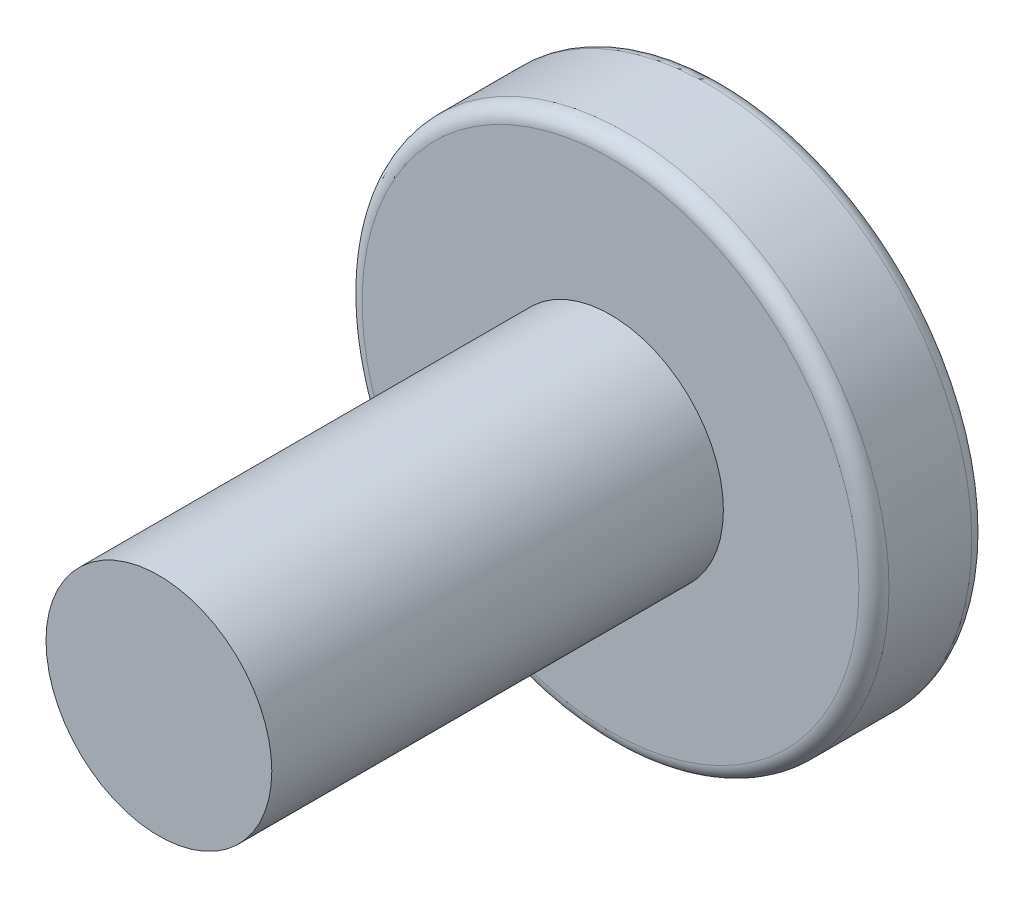
ISO-10303-21;
HEADER;
FILE_DESCRIPTION(('STEP AP214'),'2;1');
FILE_NAME('part.step','',(''),(''),'','','');
FILE_SCHEMA(('AUTOMOTIVE_DESIGN { 1 0 10303 214 1 1 1 1 }'));
ENDSEC;
DATA;
#1=APPLICATION_CONTEXT('core data for automotive mechanical design processes');
#2=APPLICATION_PROTOCOL_DEFINITION('international standard','automotive_design',2000,#1);
#3=PRODUCT_CONTEXT('',#1,'mechanical');
#4=PRODUCT('Part','Part','',(#3));
#5=PRODUCT_RELATED_PRODUCT_CATEGORY('part','',(#4));
#6=PRODUCT_DEFINITION_FORMATION('','',#4);
#7=PRODUCT_DEFINITION_CONTEXT('part definition',#1,'design');
#8=PRODUCT_DEFINITION('design','',#6,#7);
#9=PRODUCT_DEFINITION_SHAPE('','',#8);
#10=(LENGTH_UNIT() NAMED_UNIT(*) SI_UNIT(.MILLI.,.METRE.));
#11=(NAMED_UNIT(*) PLANE_ANGLE_UNIT() SI_UNIT($,.RADIAN.));
#12=(NAMED_UNIT(*) SI_UNIT($,.STERADIAN.) SOLID_ANGLE_UNIT());
#13=UNCERTAINTY_MEASURE_WITH_UNIT(LENGTH_MEASURE(1.E-05),#10,'distance_accuracy_value','');
#14=(GEOMETRIC_REPRESENTATION_CONTEXT(3) GLOBAL_UNCERTAINTY_ASSIGNED_CONTEXT((#13)) GLOBAL_UNIT_ASSIGNED_CONTEXT((#10,
#11,#12)) REPRESENTATION_CONTEXT('',''));
#15=CARTESIAN_POINT('',(0.,0.,0.));
#16=DIRECTION('',(0.,0.,1.));
#17=DIRECTION('',(1.,0.,0.));
#18=AXIS2_PLACEMENT_3D('',#15,#16,#17);
#19=CARTESIAN_POINT('',(0.,0.,1.5));
#20=DIRECTION('',(0.,0.,-1.));
#21=DIRECTION('',(-1.,0.,0.));
#22=AXIS2_PLACEMENT_3D('',#19,#20,#21);
#23=CYLINDRICAL_SURFACE('',#22,3.5);
#24=CARTESIAN_POINT('',(0.,0.,0.2));
#25=DIRECTION('',(0.,0.,1.));
#26=DIRECTION('',(1.,0.,0.));
#27=AXIS2_PLACEMENT_3D('',#24,#25,#26);
#28=CIRCLE('',#27,3.5);
#29=CARTESIAN_POINT('',(3.5,0.,0.2));
#30=VERTEX_POINT('',#29);
#31=EDGE_CURVE('E181',#30,#30,#28,.T.);
#32=ORIENTED_EDGE('',*,*,#31,.T.);
#33=EDGE_LOOP('',(#32));
#34=FACE_BOUND('',#33,.T.);
#35=CARTESIAN_POINT('',(0.,0.,1.3));
#36=DIRECTION('',(0.,0.,1.));
#37=DIRECTION('',(1.,0.,0.));
#38=AXIS2_PLACEMENT_3D('',#35,#36,#37);
#39=CIRCLE('',#38,3.5);
#40=CARTESIAN_POINT('',(3.5,0.,1.3));
#41=VERTEX_POINT('',#40);
#42=EDGE_CURVE('E177',#41,#41,#39,.F.);
#43=ORIENTED_EDGE('',*,*,#42,.T.);
#44=EDGE_LOOP('',(#43));
#45=FACE_BOUND('',#44,.T.);
#46=ADVANCED_FACE('F45',(#34,#45),#23,.T.);
#47=CARTESIAN_POINT('',(0.,0.,1.5));
#48=DIRECTION('',(0.,0.,1.));
#49=DIRECTION('',(1.,0.,0.));
#50=AXIS2_PLACEMENT_3D('',#47,#48,#49);
#51=PLANE('',#50);
#52=CARTESIAN_POINT('',(0.,0.,1.5));
#53=DIRECTION('',(0.,0.,1.));
#54=DIRECTION('',(1.,0.,0.));
#55=AXIS2_PLACEMENT_3D('',#52,#53,#54);
#56=CIRCLE('',#55,3.3);
#57=CARTESIAN_POINT('',(3.3,0.,1.5));
#58=VERTEX_POINT('',#57);
#59=EDGE_CURVE('E11',#58,#58,#56,.T.);
#60=ORIENTED_EDGE('',*,*,#59,.T.);
#61=EDGE_LOOP('',(#60));
#62=FACE_BOUND('',#61,.T.);
#63=CARTESIAN_POINT('',(0.,0.,1.5));
#64=DIRECTION('',(0.,0.,1.));
#65=DIRECTION('',(1.,0.,0.));
#66=AXIS2_PLACEMENT_3D('',#63,#64,#65);
#67=CIRCLE('',#66,1.5);
#68=CARTESIAN_POINT('',(1.5,0.,1.5));
#69=VERTEX_POINT('',#68);
#70=EDGE_CURVE('E173',#69,#69,#67,.T.);
#71=ORIENTED_EDGE('',*,*,#70,.F.);
#72=EDGE_LOOP('',(#71));
#73=FACE_BOUND('',#72,.T.);
#74=ADVANCED_FACE('F198',(#62,#73),#51,.T.);
#75=CARTESIAN_POINT('',(0.,0.,0.));
#76=DIRECTION('',(0.,0.,1.));
#77=DIRECTION('',(1.,0.,0.));
#78=AXIS2_PLACEMENT_3D('',#75,#76,#77);
#79=PLANE('',#78);
#80=DIRECTION('',(0.5,0.866025403784438,0.));
#81=VECTOR('',#80,1.);
#82=CARTESIAN_POINT('',(-1.15470053837925,0.,0.));
#83=LINE('',#82,#81);
#84=CARTESIAN_POINT('',(-1.15470053837925,0.,0.));
#85=VERTEX_POINT('',#84);
#86=CARTESIAN_POINT('',(-0.577350269189626,1.,0.));
#87=VERTEX_POINT('',#86);
#88=EDGE_CURVE('E141',#85,#87,#83,.T.);
#89=ORIENTED_EDGE('',*,*,#88,.F.);
#90=DIRECTION('',(-0.5,0.866025403784439,0.));
#91=VECTOR('',#90,1.);
#92=CARTESIAN_POINT('',(-0.577350269189626,-1.,0.));
#93=LINE('',#92,#91);
#94=CARTESIAN_POINT('',(-0.577350269189626,-1.,0.));
#95=VERTEX_POINT('',#94);
#96=EDGE_CURVE('E61',#95,#85,#93,.T.);
#97=ORIENTED_EDGE('',*,*,#96,.F.);
#98=DIRECTION('',(-1.,0.,0.));
#99=VECTOR('',#98,1.);
#100=CARTESIAN_POINT('',(0.577350269189626,-1.,0.));
#101=LINE('',#100,#99);
#102=CARTESIAN_POINT('',(0.577350269189626,-1.,0.));
#103=VERTEX_POINT('',#102);
#104=EDGE_CURVE('E154',#103,#95,#101,.T.);
#105=ORIENTED_EDGE('',*,*,#104,.F.);
#106=DIRECTION('',(-0.5,-0.866025403784438,0.));
#107=VECTOR('',#106,1.);
#108=CARTESIAN_POINT('',(1.15470053837925,0.,0.));
#109=LINE('',#108,#107);
#110=CARTESIAN_POINT('',(1.15470053837925,0.,0.));
#111=VERTEX_POINT('',#110);
#112=EDGE_CURVE('E151',#111,#103,#109,.T.);
#113=ORIENTED_EDGE('',*,*,#112,.F.);
#114=DIRECTION('',(0.5,-0.866025403784439,0.));
#115=VECTOR('',#114,1.);
#116=CARTESIAN_POINT('',(0.577350269189626,1.,0.));
#117=LINE('',#116,#115);
#118=CARTESIAN_POINT('',(0.577350269189626,1.,0.));
#119=VERTEX_POINT('',#118);
#120=EDGE_CURVE('E109',#119,#111,#117,.T.);
#121=ORIENTED_EDGE('',*,*,#120,.F.);
#122=DIRECTION('',(1.,0.,0.));
#123=VECTOR('',#122,1.);
#124=CARTESIAN_POINT('',(-0.577350269189626,1.,0.));
#125=LINE('',#124,#123);
#126=EDGE_CURVE('E145',#87,#119,#125,.T.);
#127=ORIENTED_EDGE('',*,*,#126,.F.);
#128=EDGE_LOOP('',(#89,#97,#105,#113,#121,#127));
#129=FACE_BOUND('',#128,.T.);
#130=CARTESIAN_POINT('',(0.,0.,0.));
#131=DIRECTION('',(0.,0.,1.));
#132=DIRECTION('',(1.,0.,0.));
#133=AXIS2_PLACEMENT_3D('',#130,#131,#132);
#134=CIRCLE('',#133,3.3);
#135=CARTESIAN_POINT('',(3.3,0.,0.));
#136=VERTEX_POINT('',#135);
#137=EDGE_CURVE('E54',#136,#136,#134,.F.);
#138=ORIENTED_EDGE('',*,*,#137,.T.);
#139=EDGE_LOOP('',(#138));
#140=FACE_BOUND('',#139,.T.);
#141=ADVANCED_FACE('F188',(#129,#140),#79,.F.);
#142=CARTESIAN_POINT('',(0.,0.,7.5));
#143=DIRECTION('',(0.,0.,-1.));
#144=DIRECTION('',(-1.,0.,0.));
#145=AXIS2_PLACEMENT_3D('',#142,#143,#144);
#146=CYLINDRICAL_SURFACE('',#145,1.5);
#147=CARTESIAN_POINT('',(0.,0.,7.5));
#148=DIRECTION('',(0.,0.,1.));
#149=DIRECTION('',(1.,0.,0.));
#150=AXIS2_PLACEMENT_3D('',#147,#148,#149);
#151=CIRCLE('',#150,1.5);
#152=CARTESIAN_POINT('',(1.5,0.,7.5));
#153=VERTEX_POINT('',#152);
#154=EDGE_CURVE('E160',#153,#153,#151,.T.);
#155=ORIENTED_EDGE('',*,*,#154,.F.);
#156=EDGE_LOOP('',(#155));
#157=FACE_BOUND('',#156,.T.);
#158=ORIENTED_EDGE('',*,*,#70,.T.);
#159=EDGE_LOOP('',(#158));
#160=FACE_BOUND('',#159,.T.);
#161=ADVANCED_FACE('F212',(#157,#160),#146,.T.);
#162=CARTESIAN_POINT('',(0.,0.,7.5));
#163=DIRECTION('',(0.,0.,1.));
#164=DIRECTION('',(1.,0.,0.));
#165=AXIS2_PLACEMENT_3D('',#162,#163,#164);
#166=PLANE('',#165);
#167=ORIENTED_EDGE('',*,*,#154,.T.);
#168=EDGE_LOOP('',(#167));
#169=FACE_BOUND('',#168,.T.);
#170=ADVANCED_FACE('F193',(#169),#166,.T.);
#171=CARTESIAN_POINT('',(0.,0.,0.2));
#172=DIRECTION('',(0.,0.,1.));
#173=DIRECTION('',(1.,0.,0.));
#174=AXIS2_PLACEMENT_3D('',#171,#172,#173);
#175=TOROIDAL_SURFACE('',#174,3.3,0.2);
#176=ORIENTED_EDGE('',*,*,#137,.F.);
#177=EDGE_LOOP('',(#176));
#178=FACE_BOUND('',#177,.T.);
#179=ORIENTED_EDGE('',*,*,#31,.F.);
#180=EDGE_LOOP('',(#179));
#181=FACE_BOUND('',#180,.T.);
#182=ADVANCED_FACE('F190',(#178,#181),#175,.T.);
#183=CARTESIAN_POINT('',(0.,0.,1.3));
#184=DIRECTION('',(0.,0.,1.));
#185=DIRECTION('',(1.,0.,0.));
#186=AXIS2_PLACEMENT_3D('',#183,#184,#185);
#187=TOROIDAL_SURFACE('',#186,3.3,0.2);
#188=ORIENTED_EDGE('',*,*,#42,.F.);
#189=EDGE_LOOP('',(#188));
#190=FACE_BOUND('',#189,.T.);
#191=ORIENTED_EDGE('',*,*,#59,.F.);
#192=EDGE_LOOP('',(#191));
#193=FACE_BOUND('',#192,.T.);
#194=ADVANCED_FACE('F47',(#190,#193),#187,.T.);
#195=CARTESIAN_POINT('',(-0.577350269189626,-1.,1.5));
#196=DIRECTION('',(-0.866025403784439,-0.5,0.));
#197=DIRECTION('',(0.5,-0.866025403784439,0.));
#198=AXIS2_PLACEMENT_3D('',#195,#196,#197);
#199=PLANE('',#198);
#200=ORIENTED_EDGE('',*,*,#96,.T.);
#201=DIRECTION('',(0.,0.,-1.));
#202=VECTOR('',#201,1.);
#203=CARTESIAN_POINT('',(-1.15470053837925,0.,1.5));
#204=LINE('',#203,#202);
#205=CARTESIAN_POINT('',(-1.15470053837925,0.,1.5));
#206=VERTEX_POINT('',#205);
#207=EDGE_CURVE('E91',#206,#85,#204,.T.);
#208=ORIENTED_EDGE('',*,*,#207,.F.);
#209=DIRECTION('',(-0.5,0.866025403784439,0.));
#210=VECTOR('',#209,1.);
#211=CARTESIAN_POINT('',(-0.577350269189626,-1.,1.5));
#212=LINE('',#211,#210);
#213=CARTESIAN_POINT('',(-0.577350269189626,-1.,1.5));
#214=VERTEX_POINT('',#213);
#215=EDGE_CURVE('E157',#214,#206,#212,.T.);
#216=ORIENTED_EDGE('',*,*,#215,.F.);
#217=DIRECTION('',(0.,0.,-1.));
#218=VECTOR('',#217,1.);
#219=CARTESIAN_POINT('',(-0.577350269189626,-1.,1.5));
#220=LINE('',#219,#218);
#221=EDGE_CURVE('E69',#214,#95,#220,.T.);
#222=ORIENTED_EDGE('',*,*,#221,.T.);
#223=EDGE_LOOP('',(#200,#208,#216,#222));
#224=FACE_BOUND('',#223,.T.);
#225=ADVANCED_FACE('F204',(#224),#199,.F.);
#226=CARTESIAN_POINT('',(0.577350269189626,-1.,1.5));
#227=DIRECTION('',(0.,-1.,0.));
#228=DIRECTION('',(0.,0.,-1.));
#229=AXIS2_PLACEMENT_3D('',#226,#227,#228);
#230=PLANE('',#229);
#231=ORIENTED_EDGE('',*,*,#104,.T.);
#232=ORIENTED_EDGE('',*,*,#221,.F.);
#233=DIRECTION('',(-1.,0.,0.));
#234=VECTOR('',#233,1.);
#235=CARTESIAN_POINT('',(0.577350269189626,-1.,1.5));
#236=LINE('',#235,#234);
#237=CARTESIAN_POINT('',(0.577350269189626,-1.,1.5));
#238=VERTEX_POINT('',#237);
#239=EDGE_CURVE('E123',#238,#214,#236,.T.);
#240=ORIENTED_EDGE('',*,*,#239,.F.);
#241=DIRECTION('',(0.,0.,-1.));
#242=VECTOR('',#241,1.);
#243=CARTESIAN_POINT('',(0.577350269189626,-1.,1.5));
#244=LINE('',#243,#242);
#245=EDGE_CURVE('E114',#238,#103,#244,.T.);
#246=ORIENTED_EDGE('',*,*,#245,.T.);
#247=EDGE_LOOP('',(#231,#232,#240,#246));
#248=FACE_BOUND('',#247,.T.);
#249=ADVANCED_FACE('F228',(#248),#230,.F.);
#250=CARTESIAN_POINT('',(1.15470053837925,0.,1.5));
#251=DIRECTION('',(0.866025403784439,-0.5,0.));
#252=DIRECTION('',(0.5,0.866025403784439,0.));
#253=AXIS2_PLACEMENT_3D('',#250,#251,#252);
#254=PLANE('',#253);
#255=ORIENTED_EDGE('',*,*,#112,.T.);
#256=ORIENTED_EDGE('',*,*,#245,.F.);
#257=DIRECTION('',(-0.5,-0.866025403784438,0.));
#258=VECTOR('',#257,1.);
#259=CARTESIAN_POINT('',(1.15470053837925,0.,1.5));
#260=LINE('',#259,#258);
#261=CARTESIAN_POINT('',(1.15470053837925,0.,1.5));
#262=VERTEX_POINT('',#261);
#263=EDGE_CURVE('E118',#262,#238,#260,.T.);
#264=ORIENTED_EDGE('',*,*,#263,.F.);
#265=DIRECTION('',(0.,0.,-1.));
#266=VECTOR('',#265,1.);
#267=CARTESIAN_POINT('',(1.15470053837925,0.,1.5));
#268=LINE('',#267,#266);
#269=EDGE_CURVE('E102',#262,#111,#268,.T.);
#270=ORIENTED_EDGE('',*,*,#269,.T.);
#271=EDGE_LOOP('',(#255,#256,#264,#270));
#272=FACE_BOUND('',#271,.T.);
#273=ADVANCED_FACE('F119',(#272),#254,.F.);
#274=CARTESIAN_POINT('',(0.577350269189626,1.,1.5));
#275=DIRECTION('',(0.866025403784439,0.5,0.));
#276=DIRECTION('',(-0.5,0.866025403784439,0.));
#277=AXIS2_PLACEMENT_3D('',#274,#275,#276);
#278=PLANE('',#277);
#279=ORIENTED_EDGE('',*,*,#120,.T.);
#280=ORIENTED_EDGE('',*,*,#269,.F.);
#281=DIRECTION('',(0.5,-0.866025403784439,0.));
#282=VECTOR('',#281,1.);
#283=CARTESIAN_POINT('',(0.577350269189626,1.,1.5));
#284=LINE('',#283,#282);
#285=CARTESIAN_POINT('',(0.577350269189626,1.,1.5));
#286=VERTEX_POINT('',#285);
#287=EDGE_CURVE('E106',#286,#262,#284,.T.);
#288=ORIENTED_EDGE('',*,*,#287,.F.);
#289=DIRECTION('',(0.,0.,-1.));
#290=VECTOR('',#289,1.);
#291=CARTESIAN_POINT('',(0.577350269189626,1.,1.5));
#292=LINE('',#291,#290);
#293=EDGE_CURVE('E115',#286,#119,#292,.T.);
#294=ORIENTED_EDGE('',*,*,#293,.T.);
#295=EDGE_LOOP('',(#279,#280,#288,#294));
#296=FACE_BOUND('',#295,.T.);
#297=ADVANCED_FACE('F104',(#296),#278,.F.);
#298=CARTESIAN_POINT('',(-0.577350269189626,1.,1.5));
#299=DIRECTION('',(0.,1.,0.));
#300=DIRECTION('',(0.,0.,1.));
#301=AXIS2_PLACEMENT_3D('',#298,#299,#300);
#302=PLANE('',#301);
#303=ORIENTED_EDGE('',*,*,#126,.T.);
#304=ORIENTED_EDGE('',*,*,#293,.F.);
#305=DIRECTION('',(1.,0.,0.));
#306=VECTOR('',#305,1.);
#307=CARTESIAN_POINT('',(-0.577350269189626,1.,1.5));
#308=LINE('',#307,#306);
#309=CARTESIAN_POINT('',(-0.577350269189626,1.,1.5));
#310=VERTEX_POINT('',#309);
#311=EDGE_CURVE('E129',#310,#286,#308,.T.);
#312=ORIENTED_EDGE('',*,*,#311,.F.);
#313=DIRECTION('',(0.,0.,-1.));
#314=VECTOR('',#313,1.);
#315=CARTESIAN_POINT('',(-0.577350269189626,1.,1.5));
#316=LINE('',#315,#314);
#317=EDGE_CURVE('E165',#310,#87,#316,.T.);
#318=ORIENTED_EDGE('',*,*,#317,.T.);
#319=EDGE_LOOP('',(#303,#304,#312,#318));
#320=FACE_BOUND('',#319,.T.);
#321=ADVANCED_FACE('F232',(#320),#302,.F.);
#322=CARTESIAN_POINT('',(-1.15470053837925,0.,1.5));
#323=DIRECTION('',(-0.866025403784439,0.5,0.));
#324=DIRECTION('',(-0.5,-0.866025403784439,0.));
#325=AXIS2_PLACEMENT_3D('',#322,#323,#324);
#326=PLANE('',#325);
#327=ORIENTED_EDGE('',*,*,#88,.T.);
#328=ORIENTED_EDGE('',*,*,#317,.F.);
#329=DIRECTION('',(0.5,0.866025403784438,0.));
#330=VECTOR('',#329,1.);
#331=CARTESIAN_POINT('',(-1.15470053837925,0.,1.5));
#332=LINE('',#331,#330);
#333=EDGE_CURVE('E133',#206,#310,#332,.T.);
#334=ORIENTED_EDGE('',*,*,#333,.F.);
#335=ORIENTED_EDGE('',*,*,#207,.T.);
#336=EDGE_LOOP('',(#327,#328,#334,#335));
#337=FACE_BOUND('',#336,.T.);
#338=ADVANCED_FACE('F229',(#337),#326,.F.);
#339=CARTESIAN_POINT('',(0.,0.,1.5));
#340=DIRECTION('',(0.,0.,-1.));
#341=DIRECTION('',(-1.,0.,0.));
#342=AXIS2_PLACEMENT_3D('',#339,#340,#341);
#343=PLANE('',#342);
#344=ORIENTED_EDGE('',*,*,#215,.T.);
#345=ORIENTED_EDGE('',*,*,#333,.T.);
#346=ORIENTED_EDGE('',*,*,#311,.T.);
#347=ORIENTED_EDGE('',*,*,#287,.T.);
#348=ORIENTED_EDGE('',*,*,#263,.T.);
#349=ORIENTED_EDGE('',*,*,#239,.T.);
#350=EDGE_LOOP('',(#344,#345,#346,#347,#348,#349));
#351=FACE_BOUND('',#350,.T.);
#352=ADVANCED_FACE('F126',(#351),#343,.T.);
#353=CLOSED_SHELL('',(#46,#74,#141,#161,#170,#182,#194,#225,#249,#273,#297,#321,#338,#352));
#354=MANIFOLD_SOLID_BREP('B2',#353);
#355=ADVANCED_BREP_SHAPE_REPRESENTATION('',(#18,#354),#14);
#356=SHAPE_DEFINITION_REPRESENTATION(#9,#355);
ENDSEC;
END-ISO-10303-21;
